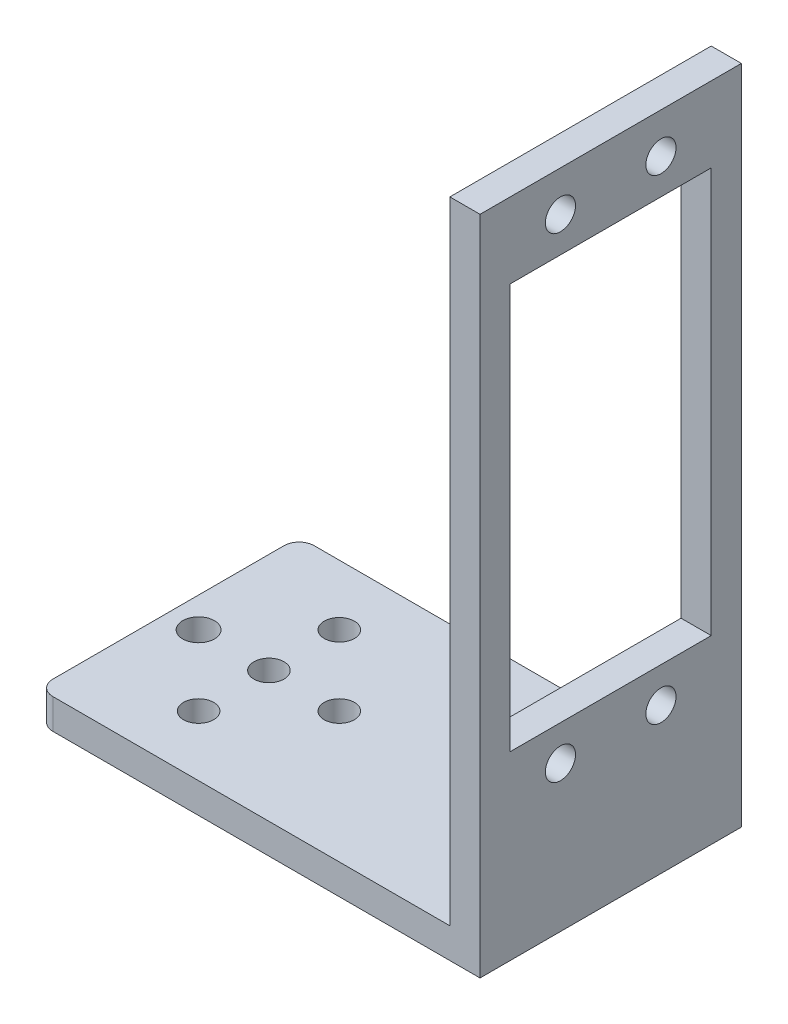
ISO-10303-21;
HEADER;
FILE_DESCRIPTION(('STEP AP214'),'2;1');
FILE_NAME('part.step','',(''),(''),'','','');
FILE_SCHEMA(('AUTOMOTIVE_DESIGN { 1 0 10303 214 1 1 1 1 }'));
ENDSEC;
DATA;
#1=APPLICATION_CONTEXT('core data for automotive mechanical design processes');
#2=APPLICATION_PROTOCOL_DEFINITION('international standard','automotive_design',2000,#1);
#3=PRODUCT_CONTEXT('',#1,'mechanical');
#4=PRODUCT('Part','Part','',(#3));
#5=PRODUCT_RELATED_PRODUCT_CATEGORY('part','',(#4));
#6=PRODUCT_DEFINITION_FORMATION('','',#4);
#7=PRODUCT_DEFINITION_CONTEXT('part definition',#1,'design');
#8=PRODUCT_DEFINITION('design','',#6,#7);
#9=PRODUCT_DEFINITION_SHAPE('','',#8);
#10=(LENGTH_UNIT() NAMED_UNIT(*) SI_UNIT(.MILLI.,.METRE.));
#11=(NAMED_UNIT(*) PLANE_ANGLE_UNIT() SI_UNIT($,.RADIAN.));
#12=(NAMED_UNIT(*) SI_UNIT($,.STERADIAN.) SOLID_ANGLE_UNIT());
#13=UNCERTAINTY_MEASURE_WITH_UNIT(LENGTH_MEASURE(1.E-05),#10,'distance_accuracy_value','');
#14=(GEOMETRIC_REPRESENTATION_CONTEXT(3) GLOBAL_UNCERTAINTY_ASSIGNED_CONTEXT((#13)) GLOBAL_UNIT_ASSIGNED_CONTEXT((#10,
#11,#12)) REPRESENTATION_CONTEXT('',''));
#15=CARTESIAN_POINT('',(0.,0.,0.));
#16=DIRECTION('',(0.,0.,1.));
#17=DIRECTION('',(1.,0.,0.));
#18=AXIS2_PLACEMENT_3D('',#15,#16,#17);
#19=CARTESIAN_POINT('',(0.,18.,0.));
#20=DIRECTION('',(0.,-1.,0.));
#21=DIRECTION('',(0.,0.,-1.));
#22=AXIS2_PLACEMENT_3D('',#19,#20,#21);
#23=PLANE('',#22);
#24=DIRECTION('',(-1.,0.,0.));
#25=VECTOR('',#24,1.);
#26=CARTESIAN_POINT('',(0.,18.,-3.00000000000004));
#27=LINE('',#26,#25);
#28=CARTESIAN_POINT('',(44.,18.,-3.00000000000001));
#29=VERTEX_POINT('',#28);
#30=CARTESIAN_POINT('',(41.,18.,-3.));
#31=VERTEX_POINT('',#30);
#32=EDGE_CURVE('E63',#29,#31,#27,.T.);
#33=ORIENTED_EDGE('',*,*,#32,.F.);
#34=DIRECTION('',(0.,0.,-1.));
#35=VECTOR('',#34,1.);
#36=CARTESIAN_POINT('',(44.,18.,-26.));
#37=LINE('',#36,#35);
#38=CARTESIAN_POINT('',(44.,18.,-23.));
#39=VERTEX_POINT('',#38);
#40=EDGE_CURVE('E204',#29,#39,#37,.T.);
#41=ORIENTED_EDGE('',*,*,#40,.T.);
#42=DIRECTION('',(-1.,0.,0.));
#43=VECTOR('',#42,1.);
#44=CARTESIAN_POINT('',(0.,18.,-23.));
#45=LINE('',#44,#43);
#46=CARTESIAN_POINT('',(41.,18.,-23.));
#47=VERTEX_POINT('',#46);
#48=EDGE_CURVE('E181',#39,#47,#45,.T.);
#49=ORIENTED_EDGE('',*,*,#48,.T.);
#50=DIRECTION('',(0.,0.,1.));
#51=VECTOR('',#50,1.);
#52=CARTESIAN_POINT('',(41.,18.,0.));
#53=LINE('',#52,#51);
#54=EDGE_CURVE('E59',#47,#31,#53,.T.);
#55=ORIENTED_EDGE('',*,*,#54,.T.);
#56=EDGE_LOOP('',(#33,#41,#49,#55));
#57=FACE_BOUND('',#56,.T.);
#58=ADVANCED_FACE('F44',(#57),#23,.F.);
#59=CARTESIAN_POINT('',(1.5,3.,-1.5));
#60=DIRECTION('',(0.,1.,0.));
#61=DIRECTION('',(0.,0.,1.));
#62=AXIS2_PLACEMENT_3D('',#59,#60,#61);
#63=PLANE('',#62);
#64=DIRECTION('',(0.,0.,1.));
#65=VECTOR('',#64,1.);
#66=CARTESIAN_POINT('',(41.,3.,0.));
#67=LINE('',#66,#65);
#68=CARTESIAN_POINT('',(41.,3.,-26.));
#69=VERTEX_POINT('',#68);
#70=CARTESIAN_POINT('',(41.,3.,0.));
#71=VERTEX_POINT('',#70);
#72=EDGE_CURVE('E203',#69,#71,#67,.T.);
#73=ORIENTED_EDGE('',*,*,#72,.F.);
#74=DIRECTION('',(-1.,0.,0.));
#75=VECTOR('',#74,1.);
#76=CARTESIAN_POINT('',(1.50000000000001,3.,-26.));
#77=LINE('',#76,#75);
#78=CARTESIAN_POINT('',(1.50000000000001,3.,-26.));
#79=VERTEX_POINT('',#78);
#80=EDGE_CURVE('E139',#69,#79,#77,.T.);
#81=ORIENTED_EDGE('',*,*,#80,.T.);
#82=CARTESIAN_POINT('',(1.5,3.,-24.5));
#83=DIRECTION('',(0.,1.,0.));
#84=DIRECTION('',(0.,0.,-1.));
#85=AXIS2_PLACEMENT_3D('',#82,#83,#84);
#86=CIRCLE('',#85,1.5);
#87=CARTESIAN_POINT('',(0.,3.,-24.5));
#88=VERTEX_POINT('',#87);
#89=EDGE_CURVE('E240',#79,#88,#86,.T.);
#90=ORIENTED_EDGE('',*,*,#89,.T.);
#91=DIRECTION('',(0.,0.,1.));
#92=VECTOR('',#91,1.);
#93=CARTESIAN_POINT('',(0.,3.,-1.50000000000001));
#94=LINE('',#93,#92);
#95=CARTESIAN_POINT('',(0.,3.,-1.50000000000001));
#96=VERTEX_POINT('',#95);
#97=EDGE_CURVE('E243',#88,#96,#94,.T.);
#98=ORIENTED_EDGE('',*,*,#97,.T.);
#99=CARTESIAN_POINT('',(1.5,3.,-1.5));
#100=DIRECTION('',(0.,1.,0.));
#101=DIRECTION('',(0.,0.,1.));
#102=AXIS2_PLACEMENT_3D('',#99,#100,#101);
#103=CIRCLE('',#102,1.5);
#104=CARTESIAN_POINT('',(1.5,3.,0.));
#105=VERTEX_POINT('',#104);
#106=EDGE_CURVE('E245',#96,#105,#103,.T.);
#107=ORIENTED_EDGE('',*,*,#106,.T.);
#108=DIRECTION('',(1.,0.,0.));
#109=VECTOR('',#108,1.);
#110=CARTESIAN_POINT('',(44.,3.,0.));
#111=LINE('',#110,#109);
#112=EDGE_CURVE('E247',#105,#71,#111,.T.);
#113=ORIENTED_EDGE('',*,*,#112,.T.);
#114=EDGE_LOOP('',(#73,#81,#90,#98,#107,#113));
#115=FACE_BOUND('',#114,.T.);
#116=CARTESIAN_POINT('',(9.99999999999999,3.,-6.));
#117=DIRECTION('',(0.,1.,0.));
#118=DIRECTION('',(0.,0.,1.));
#119=AXIS2_PLACEMENT_3D('',#116,#117,#118);
#120=CIRCLE('',#119,1.5);
#121=CARTESIAN_POINT('',(9.99999999999999,3.,-4.5));
#122=VERTEX_POINT('',#121);
#123=EDGE_CURVE('E215',#122,#122,#120,.T.);
#124=ORIENTED_EDGE('',*,*,#123,.F.);
#125=EDGE_LOOP('',(#124));
#126=FACE_BOUND('',#125,.T.);
#127=CARTESIAN_POINT('',(17.,3.,-13.));
#128=DIRECTION('',(0.,1.,0.));
#129=DIRECTION('',(0.,0.,1.));
#130=AXIS2_PLACEMENT_3D('',#127,#128,#129);
#131=CIRCLE('',#130,1.5);
#132=CARTESIAN_POINT('',(17.,3.,-11.5));
#133=VERTEX_POINT('',#132);
#134=EDGE_CURVE('E227',#133,#133,#131,.T.);
#135=ORIENTED_EDGE('',*,*,#134,.F.);
#136=EDGE_LOOP('',(#135));
#137=FACE_BOUND('',#136,.T.);
#138=CARTESIAN_POINT('',(9.99999999999999,3.,-13.));
#139=DIRECTION('',(0.,1.,0.));
#140=DIRECTION('',(0.,0.,1.));
#141=AXIS2_PLACEMENT_3D('',#138,#139,#140);
#142=CIRCLE('',#141,1.5);
#143=CARTESIAN_POINT('',(9.99999999999999,3.,-11.5));
#144=VERTEX_POINT('',#143);
#145=EDGE_CURVE('E233',#144,#144,#142,.T.);
#146=ORIENTED_EDGE('',*,*,#145,.F.);
#147=EDGE_LOOP('',(#146));
#148=FACE_BOUND('',#147,.T.);
#149=CARTESIAN_POINT('',(9.99999999999999,3.,-20.));
#150=DIRECTION('',(0.,1.,0.));
#151=DIRECTION('',(0.,0.,1.));
#152=AXIS2_PLACEMENT_3D('',#149,#150,#151);
#153=CIRCLE('',#152,1.5);
#154=CARTESIAN_POINT('',(9.99999999999999,3.,-18.5));
#155=VERTEX_POINT('',#154);
#156=EDGE_CURVE('E221',#155,#155,#153,.T.);
#157=ORIENTED_EDGE('',*,*,#156,.F.);
#158=EDGE_LOOP('',(#157));
#159=FACE_BOUND('',#158,.T.);
#160=CARTESIAN_POINT('',(2.99999999999999,3.,-13.));
#161=DIRECTION('',(0.,1.,0.));
#162=DIRECTION('',(0.,0.,1.));
#163=AXIS2_PLACEMENT_3D('',#160,#161,#162);
#164=CIRCLE('',#163,1.58);
#165=CARTESIAN_POINT('',(2.99999999999999,3.,-11.42));
#166=VERTEX_POINT('',#165);
#167=EDGE_CURVE('E209',#166,#166,#164,.T.);
#168=ORIENTED_EDGE('',*,*,#167,.F.);
#169=EDGE_LOOP('',(#168));
#170=FACE_BOUND('',#169,.T.);
#171=ADVANCED_FACE('F294',(#115,#126,#137,#148,#159,#170),#63,.T.);
#172=CARTESIAN_POINT('',(1.5,0.,-1.5));
#173=DIRECTION('',(0.,1.,0.));
#174=DIRECTION('',(0.,0.,1.));
#175=AXIS2_PLACEMENT_3D('',#172,#173,#174);
#176=PLANE('',#175);
#177=DIRECTION('',(0.,0.,-1.));
#178=VECTOR('',#177,1.);
#179=CARTESIAN_POINT('',(44.,0.,-26.));
#180=LINE('',#179,#178);
#181=CARTESIAN_POINT('',(44.,0.,0.));
#182=VERTEX_POINT('',#181);
#183=CARTESIAN_POINT('',(44.,0.,-26.));
#184=VERTEX_POINT('',#183);
#185=EDGE_CURVE('E236',#182,#184,#180,.T.);
#186=ORIENTED_EDGE('',*,*,#185,.F.);
#187=DIRECTION('',(1.,0.,0.));
#188=VECTOR('',#187,1.);
#189=CARTESIAN_POINT('',(44.,0.,0.));
#190=LINE('',#189,#188);
#191=CARTESIAN_POINT('',(1.5,0.,0.));
#192=VERTEX_POINT('',#191);
#193=EDGE_CURVE('E241',#192,#182,#190,.T.);
#194=ORIENTED_EDGE('',*,*,#193,.F.);
#195=CARTESIAN_POINT('',(1.5,0.,-1.5));
#196=DIRECTION('',(0.,1.,0.));
#197=DIRECTION('',(0.,0.,1.));
#198=AXIS2_PLACEMENT_3D('',#195,#196,#197);
#199=CIRCLE('',#198,1.5);
#200=CARTESIAN_POINT('',(0.,0.,-1.50000000000001));
#201=VERTEX_POINT('',#200);
#202=EDGE_CURVE('E258',#201,#192,#199,.T.);
#203=ORIENTED_EDGE('',*,*,#202,.F.);
#204=DIRECTION('',(0.,0.,1.));
#205=VECTOR('',#204,1.);
#206=CARTESIAN_POINT('',(0.,0.,-1.50000000000001));
#207=LINE('',#206,#205);
#208=CARTESIAN_POINT('',(0.,0.,-24.5));
#209=VERTEX_POINT('',#208);
#210=EDGE_CURVE('E256',#209,#201,#207,.T.);
#211=ORIENTED_EDGE('',*,*,#210,.F.);
#212=CARTESIAN_POINT('',(1.5,0.,-24.5));
#213=DIRECTION('',(0.,1.,0.));
#214=DIRECTION('',(0.,0.,-1.));
#215=AXIS2_PLACEMENT_3D('',#212,#213,#214);
#216=CIRCLE('',#215,1.5);
#217=CARTESIAN_POINT('',(1.50000000000001,0.,-26.));
#218=VERTEX_POINT('',#217);
#219=EDGE_CURVE('E254',#218,#209,#216,.T.);
#220=ORIENTED_EDGE('',*,*,#219,.F.);
#221=DIRECTION('',(-1.,0.,0.));
#222=VECTOR('',#221,1.);
#223=CARTESIAN_POINT('',(1.50000000000001,0.,-26.));
#224=LINE('',#223,#222);
#225=EDGE_CURVE('E252',#184,#218,#224,.T.);
#226=ORIENTED_EDGE('',*,*,#225,.F.);
#227=EDGE_LOOP('',(#186,#194,#203,#211,#220,#226));
#228=FACE_BOUND('',#227,.T.);
#229=CARTESIAN_POINT('',(9.99999999999999,0.,-13.));
#230=DIRECTION('',(0.,1.,0.));
#231=DIRECTION('',(0.,0.,1.));
#232=AXIS2_PLACEMENT_3D('',#229,#230,#231);
#233=CIRCLE('',#232,1.5);
#234=CARTESIAN_POINT('',(9.99999999999999,0.,-11.5));
#235=VERTEX_POINT('',#234);
#236=EDGE_CURVE('E230',#235,#235,#233,.T.);
#237=ORIENTED_EDGE('',*,*,#236,.T.);
#238=EDGE_LOOP('',(#237));
#239=FACE_BOUND('',#238,.T.);
#240=CARTESIAN_POINT('',(17.,0.,-13.));
#241=DIRECTION('',(0.,1.,0.));
#242=DIRECTION('',(0.,0.,1.));
#243=AXIS2_PLACEMENT_3D('',#240,#241,#242);
#244=CIRCLE('',#243,1.5);
#245=CARTESIAN_POINT('',(17.,0.,-11.5));
#246=VERTEX_POINT('',#245);
#247=EDGE_CURVE('E224',#246,#246,#244,.T.);
#248=ORIENTED_EDGE('',*,*,#247,.T.);
#249=EDGE_LOOP('',(#248));
#250=FACE_BOUND('',#249,.T.);
#251=CARTESIAN_POINT('',(9.99999999999999,0.,-20.));
#252=DIRECTION('',(0.,1.,0.));
#253=DIRECTION('',(0.,0.,1.));
#254=AXIS2_PLACEMENT_3D('',#251,#252,#253);
#255=CIRCLE('',#254,1.5);
#256=CARTESIAN_POINT('',(9.99999999999999,0.,-18.5));
#257=VERTEX_POINT('',#256);
#258=EDGE_CURVE('E218',#257,#257,#255,.T.);
#259=ORIENTED_EDGE('',*,*,#258,.T.);
#260=EDGE_LOOP('',(#259));
#261=FACE_BOUND('',#260,.T.);
#262=CARTESIAN_POINT('',(9.99999999999999,0.,-6.));
#263=DIRECTION('',(0.,1.,0.));
#264=DIRECTION('',(0.,0.,1.));
#265=AXIS2_PLACEMENT_3D('',#262,#263,#264);
#266=CIRCLE('',#265,1.5);
#267=CARTESIAN_POINT('',(9.99999999999999,0.,-4.5));
#268=VERTEX_POINT('',#267);
#269=EDGE_CURVE('E212',#268,#268,#266,.T.);
#270=ORIENTED_EDGE('',*,*,#269,.T.);
#271=EDGE_LOOP('',(#270));
#272=FACE_BOUND('',#271,.T.);
#273=CARTESIAN_POINT('',(2.99999999999999,0.,-13.));
#274=DIRECTION('',(0.,1.,0.));
#275=DIRECTION('',(0.,0.,1.));
#276=AXIS2_PLACEMENT_3D('',#273,#274,#275);
#277=CIRCLE('',#276,1.58);
#278=CARTESIAN_POINT('',(2.99999999999999,0.,-11.42));
#279=VERTEX_POINT('',#278);
#280=EDGE_CURVE('E142',#279,#279,#277,.T.);
#281=ORIENTED_EDGE('',*,*,#280,.T.);
#282=EDGE_LOOP('',(#281));
#283=FACE_BOUND('',#282,.T.);
#284=ADVANCED_FACE('F280',(#228,#239,#250,#261,#272,#283),#176,.F.);
#285=CARTESIAN_POINT('',(44.,3.,-26.));
#286=DIRECTION('',(-1.,0.,0.));
#287=DIRECTION('',(0.,0.,1.));
#288=AXIS2_PLACEMENT_3D('',#285,#286,#287);
#289=PLANE('',#288);
#290=CARTESIAN_POINT('',(44.,61.8,-18.));
#291=DIRECTION('',(-1.,0.,0.));
#292=DIRECTION('',(0.,0.,1.));
#293=AXIS2_PLACEMENT_3D('',#290,#291,#292);
#294=CIRCLE('',#293,1.5);
#295=CARTESIAN_POINT('',(44.,61.8,-16.5));
#296=VERTEX_POINT('',#295);
#297=EDGE_CURVE('E164',#296,#296,#294,.T.);
#298=ORIENTED_EDGE('',*,*,#297,.T.);
#299=EDGE_LOOP('',(#298));
#300=FACE_BOUND('',#299,.T.);
#301=CARTESIAN_POINT('',(44.,61.8,-8.));
#302=DIRECTION('',(-1.,0.,0.));
#303=DIRECTION('',(0.,0.,1.));
#304=AXIS2_PLACEMENT_3D('',#301,#302,#303);
#305=CIRCLE('',#304,1.5);
#306=CARTESIAN_POINT('',(44.,61.8,-6.5));
#307=VERTEX_POINT('',#306);
#308=EDGE_CURVE('E449',#307,#307,#305,.T.);
#309=ORIENTED_EDGE('',*,*,#308,.T.);
#310=EDGE_LOOP('',(#309));
#311=FACE_BOUND('',#310,.T.);
#312=DIRECTION('',(0.,-1.,0.));
#313=VECTOR('',#312,1.);
#314=CARTESIAN_POINT('',(44.,3.,-26.));
#315=LINE('',#314,#313);
#316=CARTESIAN_POINT('',(44.,65.8,-26.));
#317=VERTEX_POINT('',#316);
#318=EDGE_CURVE('E11',#317,#184,#315,.T.);
#319=ORIENTED_EDGE('',*,*,#318,.F.);
#320=DIRECTION('',(0.,0.,-1.));
#321=VECTOR('',#320,1.);
#322=CARTESIAN_POINT('',(44.,65.8,0.));
#323=LINE('',#322,#321);
#324=CARTESIAN_POINT('',(44.,65.8,0.));
#325=VERTEX_POINT('',#324);
#326=EDGE_CURVE('E157',#325,#317,#323,.T.);
#327=ORIENTED_EDGE('',*,*,#326,.F.);
#328=DIRECTION('',(0.,-1.,0.));
#329=VECTOR('',#328,1.);
#330=CARTESIAN_POINT('',(44.,3.,0.));
#331=LINE('',#330,#329);
#332=EDGE_CURVE('E249',#325,#182,#331,.T.);
#333=ORIENTED_EDGE('',*,*,#332,.T.);
#334=ORIENTED_EDGE('',*,*,#185,.T.);
#335=EDGE_LOOP('',(#319,#327,#333,#334));
#336=FACE_BOUND('',#335,.T.);
#337=CARTESIAN_POINT('',(44.,14.5,-18.));
#338=DIRECTION('',(-1.,0.,0.));
#339=DIRECTION('',(0.,0.,1.));
#340=AXIS2_PLACEMENT_3D('',#337,#338,#339);
#341=CIRCLE('',#340,1.5);
#342=CARTESIAN_POINT('',(44.,14.5,-16.5));
#343=VERTEX_POINT('',#342);
#344=EDGE_CURVE('E200',#343,#343,#341,.T.);
#345=ORIENTED_EDGE('',*,*,#344,.T.);
#346=EDGE_LOOP('',(#345));
#347=FACE_BOUND('',#346,.T.);
#348=CARTESIAN_POINT('',(44.,14.5,-8.));
#349=DIRECTION('',(-1.,0.,0.));
#350=DIRECTION('',(0.,0.,1.));
#351=AXIS2_PLACEMENT_3D('',#348,#349,#350);
#352=CIRCLE('',#351,1.5);
#353=CARTESIAN_POINT('',(44.,14.5,-6.5));
#354=VERTEX_POINT('',#353);
#355=EDGE_CURVE('E195',#354,#354,#352,.T.);
#356=ORIENTED_EDGE('',*,*,#355,.T.);
#357=EDGE_LOOP('',(#356));
#358=FACE_BOUND('',#357,.T.);
#359=DIRECTION('',(0.,0.,-1.));
#360=VECTOR('',#359,1.);
#361=CARTESIAN_POINT('',(44.,58.3,0.));
#362=LINE('',#361,#360);
#363=CARTESIAN_POINT('',(44.,58.3,-3.));
#364=VERTEX_POINT('',#363);
#365=CARTESIAN_POINT('',(44.,58.3,-23.));
#366=VERTEX_POINT('',#365);
#367=EDGE_CURVE('E158',#364,#366,#362,.T.);
#368=ORIENTED_EDGE('',*,*,#367,.T.);
#369=DIRECTION('',(0.,-1.,0.));
#370=VECTOR('',#369,1.);
#371=CARTESIAN_POINT('',(44.,58.3,-23.));
#372=LINE('',#371,#370);
#373=EDGE_CURVE('E188',#366,#39,#372,.T.);
#374=ORIENTED_EDGE('',*,*,#373,.T.);
#375=ORIENTED_EDGE('',*,*,#40,.F.);
#376=DIRECTION('',(0.,-1.,0.));
#377=VECTOR('',#376,1.);
#378=CARTESIAN_POINT('',(44.,58.3,-3.));
#379=LINE('',#378,#377);
#380=EDGE_CURVE('E178',#364,#29,#379,.T.);
#381=ORIENTED_EDGE('',*,*,#380,.F.);
#382=EDGE_LOOP('',(#368,#374,#375,#381));
#383=FACE_BOUND('',#382,.T.);
#384=ADVANCED_FACE('F46',(#300,#311,#336,#347,#358,#383),#289,.F.);
#385=CARTESIAN_POINT('',(1.50000000000001,3.,-26.));
#386=DIRECTION('',(0.,0.,1.));
#387=DIRECTION('',(1.,0.,0.));
#388=AXIS2_PLACEMENT_3D('',#385,#386,#387);
#389=PLANE('',#388);
#390=ORIENTED_EDGE('',*,*,#225,.T.);
#391=DIRECTION('',(0.,-1.,0.));
#392=VECTOR('',#391,1.);
#393=CARTESIAN_POINT('',(1.50000000000001,3.,-26.));
#394=LINE('',#393,#392);
#395=EDGE_CURVE('E52',#79,#218,#394,.T.);
#396=ORIENTED_EDGE('',*,*,#395,.F.);
#397=ORIENTED_EDGE('',*,*,#80,.F.);
#398=DIRECTION('',(0.,-1.,0.));
#399=VECTOR('',#398,1.);
#400=CARTESIAN_POINT('',(41.,18.,-26.));
#401=LINE('',#400,#399);
#402=CARTESIAN_POINT('',(41.,65.8,-26.));
#403=VERTEX_POINT('',#402);
#404=EDGE_CURVE('E133',#403,#69,#401,.T.);
#405=ORIENTED_EDGE('',*,*,#404,.F.);
#406=DIRECTION('',(-1.,0.,0.));
#407=VECTOR('',#406,1.);
#408=CARTESIAN_POINT('',(44.,65.8,-26.));
#409=LINE('',#408,#407);
#410=EDGE_CURVE('E137',#317,#403,#409,.T.);
#411=ORIENTED_EDGE('',*,*,#410,.F.);
#412=ORIENTED_EDGE('',*,*,#318,.T.);
#413=EDGE_LOOP('',(#390,#396,#397,#405,#411,#412));
#414=FACE_BOUND('',#413,.T.);
#415=ADVANCED_FACE('F135',(#414),#389,.F.);
#416=CARTESIAN_POINT('',(1.5,3.,-24.5));
#417=DIRECTION('',(0.,-1.,0.));
#418=DIRECTION('',(0.,0.,-1.));
#419=AXIS2_PLACEMENT_3D('',#416,#417,#418);
#420=CYLINDRICAL_SURFACE('',#419,1.5);
#421=ORIENTED_EDGE('',*,*,#219,.T.);
#422=DIRECTION('',(0.,-1.,0.));
#423=VECTOR('',#422,1.);
#424=CARTESIAN_POINT('',(0.,3.,-24.5));
#425=LINE('',#424,#423);
#426=EDGE_CURVE('E269',#88,#209,#425,.T.);
#427=ORIENTED_EDGE('',*,*,#426,.F.);
#428=ORIENTED_EDGE('',*,*,#89,.F.);
#429=ORIENTED_EDGE('',*,*,#395,.T.);
#430=EDGE_LOOP('',(#421,#427,#428,#429));
#431=FACE_BOUND('',#430,.T.);
#432=ADVANCED_FACE('F275',(#431),#420,.T.);
#433=CARTESIAN_POINT('',(0.,3.,-1.50000000000001));
#434=DIRECTION('',(1.,0.,0.));
#435=DIRECTION('',(0.,0.,-1.));
#436=AXIS2_PLACEMENT_3D('',#433,#434,#435);
#437=PLANE('',#436);
#438=ORIENTED_EDGE('',*,*,#210,.T.);
#439=DIRECTION('',(0.,-1.,0.));
#440=VECTOR('',#439,1.);
#441=CARTESIAN_POINT('',(0.,3.,-1.50000000000001));
#442=LINE('',#441,#440);
#443=EDGE_CURVE('E266',#96,#201,#442,.T.);
#444=ORIENTED_EDGE('',*,*,#443,.F.);
#445=ORIENTED_EDGE('',*,*,#97,.F.);
#446=ORIENTED_EDGE('',*,*,#426,.T.);
#447=EDGE_LOOP('',(#438,#444,#445,#446));
#448=FACE_BOUND('',#447,.T.);
#449=ADVANCED_FACE('F286',(#448),#437,.F.);
#450=CARTESIAN_POINT('',(1.5,3.,-1.5));
#451=DIRECTION('',(0.,-1.,0.));
#452=DIRECTION('',(0.,0.,-1.));
#453=AXIS2_PLACEMENT_3D('',#450,#451,#452);
#454=CYLINDRICAL_SURFACE('',#453,1.5);
#455=ORIENTED_EDGE('',*,*,#202,.T.);
#456=DIRECTION('',(0.,-1.,0.));
#457=VECTOR('',#456,1.);
#458=CARTESIAN_POINT('',(1.5,3.,0.));
#459=LINE('',#458,#457);
#460=EDGE_CURVE('E263',#105,#192,#459,.T.);
#461=ORIENTED_EDGE('',*,*,#460,.F.);
#462=ORIENTED_EDGE('',*,*,#106,.F.);
#463=ORIENTED_EDGE('',*,*,#443,.T.);
#464=EDGE_LOOP('',(#455,#461,#462,#463));
#465=FACE_BOUND('',#464,.T.);
#466=ADVANCED_FACE('F290',(#465),#454,.T.);
#467=CARTESIAN_POINT('',(44.,3.,0.));
#468=DIRECTION('',(0.,0.,-1.));
#469=DIRECTION('',(-1.,0.,0.));
#470=AXIS2_PLACEMENT_3D('',#467,#468,#469);
#471=PLANE('',#470);
#472=ORIENTED_EDGE('',*,*,#193,.T.);
#473=ORIENTED_EDGE('',*,*,#332,.F.);
#474=DIRECTION('',(1.,0.,0.));
#475=VECTOR('',#474,1.);
#476=CARTESIAN_POINT('',(41.,65.8,0.));
#477=LINE('',#476,#475);
#478=CARTESIAN_POINT('',(41.,65.8,0.));
#479=VERTEX_POINT('',#478);
#480=EDGE_CURVE('E152',#479,#325,#477,.T.);
#481=ORIENTED_EDGE('',*,*,#480,.F.);
#482=DIRECTION('',(0.,-1.,0.));
#483=VECTOR('',#482,1.);
#484=CARTESIAN_POINT('',(41.,18.,0.));
#485=LINE('',#484,#483);
#486=EDGE_CURVE('E143',#479,#71,#485,.T.);
#487=ORIENTED_EDGE('',*,*,#486,.T.);
#488=ORIENTED_EDGE('',*,*,#112,.F.);
#489=ORIENTED_EDGE('',*,*,#460,.T.);
#490=EDGE_LOOP('',(#472,#473,#481,#487,#488,#489));
#491=FACE_BOUND('',#490,.T.);
#492=ADVANCED_FACE('F297',(#491),#471,.F.);
#493=CARTESIAN_POINT('',(9.99999999999999,3.,-13.));
#494=DIRECTION('',(0.,-1.,0.));
#495=DIRECTION('',(0.,0.,-1.));
#496=AXIS2_PLACEMENT_3D('',#493,#494,#495);
#497=CYLINDRICAL_SURFACE('',#496,1.5);
#498=ORIENTED_EDGE('',*,*,#145,.T.);
#499=EDGE_LOOP('',(#498));
#500=FACE_BOUND('',#499,.T.);
#501=ORIENTED_EDGE('',*,*,#236,.F.);
#502=EDGE_LOOP('',(#501));
#503=FACE_BOUND('',#502,.T.);
#504=ADVANCED_FACE('F358',(#500,#503),#497,.F.);
#505=CARTESIAN_POINT('',(17.,3.,-13.));
#506=DIRECTION('',(0.,-1.,0.));
#507=DIRECTION('',(0.,0.,-1.));
#508=AXIS2_PLACEMENT_3D('',#505,#506,#507);
#509=CYLINDRICAL_SURFACE('',#508,1.5);
#510=ORIENTED_EDGE('',*,*,#134,.T.);
#511=EDGE_LOOP('',(#510));
#512=FACE_BOUND('',#511,.T.);
#513=ORIENTED_EDGE('',*,*,#247,.F.);
#514=EDGE_LOOP('',(#513));
#515=FACE_BOUND('',#514,.T.);
#516=ADVANCED_FACE('F354',(#512,#515),#509,.F.);
#517=CARTESIAN_POINT('',(9.99999999999999,3.,-20.));
#518=DIRECTION('',(0.,-1.,0.));
#519=DIRECTION('',(0.,0.,-1.));
#520=AXIS2_PLACEMENT_3D('',#517,#518,#519);
#521=CYLINDRICAL_SURFACE('',#520,1.5);
#522=ORIENTED_EDGE('',*,*,#156,.T.);
#523=EDGE_LOOP('',(#522));
#524=FACE_BOUND('',#523,.T.);
#525=ORIENTED_EDGE('',*,*,#258,.F.);
#526=EDGE_LOOP('',(#525));
#527=FACE_BOUND('',#526,.T.);
#528=ADVANCED_FACE('F350',(#524,#527),#521,.F.);
#529=CARTESIAN_POINT('',(9.99999999999999,3.,-6.));
#530=DIRECTION('',(0.,-1.,0.));
#531=DIRECTION('',(0.,0.,-1.));
#532=AXIS2_PLACEMENT_3D('',#529,#530,#531);
#533=CYLINDRICAL_SURFACE('',#532,1.5);
#534=ORIENTED_EDGE('',*,*,#123,.T.);
#535=EDGE_LOOP('',(#534));
#536=FACE_BOUND('',#535,.T.);
#537=ORIENTED_EDGE('',*,*,#269,.F.);
#538=EDGE_LOOP('',(#537));
#539=FACE_BOUND('',#538,.T.);
#540=ADVANCED_FACE('F346',(#536,#539),#533,.F.);
#541=CARTESIAN_POINT('',(2.99999999999999,3.,-13.));
#542=DIRECTION('',(0.,-1.,0.));
#543=DIRECTION('',(0.,0.,-1.));
#544=AXIS2_PLACEMENT_3D('',#541,#542,#543);
#545=CYLINDRICAL_SURFACE('',#544,1.58);
#546=ORIENTED_EDGE('',*,*,#167,.T.);
#547=EDGE_LOOP('',(#546));
#548=FACE_BOUND('',#547,.T.);
#549=ORIENTED_EDGE('',*,*,#280,.F.);
#550=EDGE_LOOP('',(#549));
#551=FACE_BOUND('',#550,.T.);
#552=ADVANCED_FACE('F342',(#548,#551),#545,.F.);
#553=CARTESIAN_POINT('',(41.,18.,0.));
#554=DIRECTION('',(1.,0.,0.));
#555=DIRECTION('',(0.,0.,-1.));
#556=AXIS2_PLACEMENT_3D('',#553,#554,#555);
#557=PLANE('',#556);
#558=CARTESIAN_POINT('',(41.,61.8,-18.));
#559=DIRECTION('',(-1.,0.,0.));
#560=DIRECTION('',(0.,0.,1.));
#561=AXIS2_PLACEMENT_3D('',#558,#559,#560);
#562=CIRCLE('',#561,1.5);
#563=CARTESIAN_POINT('',(41.,61.8,-16.5));
#564=VERTEX_POINT('',#563);
#565=EDGE_CURVE('E446',#564,#564,#562,.T.);
#566=ORIENTED_EDGE('',*,*,#565,.F.);
#567=EDGE_LOOP('',(#566));
#568=FACE_BOUND('',#567,.T.);
#569=CARTESIAN_POINT('',(41.,61.8,-8.));
#570=DIRECTION('',(-1.,0.,0.));
#571=DIRECTION('',(0.,0.,-1.));
#572=AXIS2_PLACEMENT_3D('',#569,#570,#571);
#573=CIRCLE('',#572,1.5);
#574=CARTESIAN_POINT('',(41.,61.8,-9.5));
#575=VERTEX_POINT('',#574);
#576=EDGE_CURVE('E453',#575,#575,#573,.T.);
#577=ORIENTED_EDGE('',*,*,#576,.F.);
#578=EDGE_LOOP('',(#577));
#579=FACE_BOUND('',#578,.T.);
#580=DIRECTION('',(0.,-1.,0.));
#581=VECTOR('',#580,1.);
#582=CARTESIAN_POINT('',(41.,58.3,-23.));
#583=LINE('',#582,#581);
#584=CARTESIAN_POINT('',(41.,58.3,-23.));
#585=VERTEX_POINT('',#584);
#586=EDGE_CURVE('E185',#585,#47,#583,.T.);
#587=ORIENTED_EDGE('',*,*,#586,.F.);
#588=DIRECTION('',(0.,0.,1.));
#589=VECTOR('',#588,1.);
#590=CARTESIAN_POINT('',(41.,58.3,-26.));
#591=LINE('',#590,#589);
#592=CARTESIAN_POINT('',(41.,58.3,-3.));
#593=VERTEX_POINT('',#592);
#594=EDGE_CURVE('E161',#585,#593,#591,.T.);
#595=ORIENTED_EDGE('',*,*,#594,.T.);
#596=DIRECTION('',(0.,-1.,0.));
#597=VECTOR('',#596,1.);
#598=CARTESIAN_POINT('',(41.,58.3,-3.));
#599=LINE('',#598,#597);
#600=EDGE_CURVE('E174',#593,#31,#599,.T.);
#601=ORIENTED_EDGE('',*,*,#600,.T.);
#602=ORIENTED_EDGE('',*,*,#54,.F.);
#603=EDGE_LOOP('',(#587,#595,#601,#602));
#604=FACE_BOUND('',#603,.T.);
#605=CARTESIAN_POINT('',(41.,14.5,-18.));
#606=DIRECTION('',(-1.,0.,0.));
#607=DIRECTION('',(0.,0.,1.));
#608=AXIS2_PLACEMENT_3D('',#605,#606,#607);
#609=CIRCLE('',#608,1.5);
#610=CARTESIAN_POINT('',(41.,14.5,-16.5));
#611=VERTEX_POINT('',#610);
#612=EDGE_CURVE('E192',#611,#611,#609,.T.);
#613=ORIENTED_EDGE('',*,*,#612,.F.);
#614=EDGE_LOOP('',(#613));
#615=FACE_BOUND('',#614,.T.);
#616=CARTESIAN_POINT('',(41.,14.5,-8.));
#617=DIRECTION('',(-1.,0.,0.));
#618=DIRECTION('',(0.,0.,-1.));
#619=AXIS2_PLACEMENT_3D('',#616,#617,#618);
#620=CIRCLE('',#619,1.5);
#621=CARTESIAN_POINT('',(41.,14.5,-9.5));
#622=VERTEX_POINT('',#621);
#623=EDGE_CURVE('E191',#622,#622,#620,.T.);
#624=ORIENTED_EDGE('',*,*,#623,.F.);
#625=EDGE_LOOP('',(#624));
#626=FACE_BOUND('',#625,.T.);
#627=ORIENTED_EDGE('',*,*,#72,.T.);
#628=ORIENTED_EDGE('',*,*,#486,.F.);
#629=DIRECTION('',(0.,0.,1.));
#630=VECTOR('',#629,1.);
#631=CARTESIAN_POINT('',(41.,65.8,-26.));
#632=LINE('',#631,#630);
#633=EDGE_CURVE('E146',#403,#479,#632,.T.);
#634=ORIENTED_EDGE('',*,*,#633,.F.);
#635=ORIENTED_EDGE('',*,*,#404,.T.);
#636=EDGE_LOOP('',(#627,#628,#634,#635));
#637=FACE_BOUND('',#636,.T.);
#638=ADVANCED_FACE('F147',(#568,#579,#604,#615,#626,#637),#557,.F.);
#639=CARTESIAN_POINT('',(56.,14.5,-8.));
#640=DIRECTION('',(-1.,0.,0.));
#641=DIRECTION('',(0.,0.,1.));
#642=AXIS2_PLACEMENT_3D('',#639,#640,#641);
#643=CYLINDRICAL_SURFACE('',#642,1.5);
#644=ORIENTED_EDGE('',*,*,#623,.T.);
#645=EDGE_LOOP('',(#644));
#646=FACE_BOUND('',#645,.T.);
#647=ORIENTED_EDGE('',*,*,#355,.F.);
#648=EDGE_LOOP('',(#647));
#649=FACE_BOUND('',#648,.T.);
#650=ADVANCED_FACE('F338',(#646,#649),#643,.F.);
#651=CARTESIAN_POINT('',(56.,14.5,-18.));
#652=DIRECTION('',(-1.,0.,0.));
#653=DIRECTION('',(0.,0.,1.));
#654=AXIS2_PLACEMENT_3D('',#651,#652,#653);
#655=CYLINDRICAL_SURFACE('',#654,1.5);
#656=ORIENTED_EDGE('',*,*,#612,.T.);
#657=EDGE_LOOP('',(#656));
#658=FACE_BOUND('',#657,.T.);
#659=ORIENTED_EDGE('',*,*,#344,.F.);
#660=EDGE_LOOP('',(#659));
#661=FACE_BOUND('',#660,.T.);
#662=ADVANCED_FACE('F326',(#658,#661),#655,.F.);
#663=CARTESIAN_POINT('',(0.,58.3,-23.));
#664=DIRECTION('',(0.,0.,1.));
#665=DIRECTION('',(1.,0.,0.));
#666=AXIS2_PLACEMENT_3D('',#663,#664,#665);
#667=PLANE('',#666);
#668=ORIENTED_EDGE('',*,*,#48,.F.);
#669=ORIENTED_EDGE('',*,*,#373,.F.);
#670=DIRECTION('',(-1.,0.,0.));
#671=VECTOR('',#670,1.);
#672=CARTESIAN_POINT('',(0.,58.3,-23.));
#673=LINE('',#672,#671);
#674=EDGE_CURVE('E182',#366,#585,#673,.T.);
#675=ORIENTED_EDGE('',*,*,#674,.T.);
#676=ORIENTED_EDGE('',*,*,#586,.T.);
#677=EDGE_LOOP('',(#668,#669,#675,#676));
#678=FACE_BOUND('',#677,.T.);
#679=ADVANCED_FACE('F314',(#678),#667,.T.);
#680=CARTESIAN_POINT('',(0.,58.3,-3.00000000000004));
#681=DIRECTION('',(0.,0.,1.));
#682=DIRECTION('',(1.,0.,0.));
#683=AXIS2_PLACEMENT_3D('',#680,#681,#682);
#684=PLANE('',#683);
#685=ORIENTED_EDGE('',*,*,#32,.T.);
#686=ORIENTED_EDGE('',*,*,#600,.F.);
#687=DIRECTION('',(-1.,0.,0.));
#688=VECTOR('',#687,1.);
#689=CARTESIAN_POINT('',(0.,58.3,-3.00000000000004));
#690=LINE('',#689,#688);
#691=EDGE_CURVE('E171',#364,#593,#690,.T.);
#692=ORIENTED_EDGE('',*,*,#691,.F.);
#693=ORIENTED_EDGE('',*,*,#380,.T.);
#694=EDGE_LOOP('',(#685,#686,#692,#693));
#695=FACE_BOUND('',#694,.T.);
#696=ADVANCED_FACE('F318',(#695),#684,.F.);
#697=CARTESIAN_POINT('',(0.,58.3,0.));
#698=DIRECTION('',(0.,1.,0.));
#699=DIRECTION('',(0.,0.,1.));
#700=AXIS2_PLACEMENT_3D('',#697,#698,#699);
#701=PLANE('',#700);
#702=ORIENTED_EDGE('',*,*,#674,.F.);
#703=ORIENTED_EDGE('',*,*,#367,.F.);
#704=ORIENTED_EDGE('',*,*,#691,.T.);
#705=ORIENTED_EDGE('',*,*,#594,.F.);
#706=EDGE_LOOP('',(#702,#703,#704,#705));
#707=FACE_BOUND('',#706,.T.);
#708=ADVANCED_FACE('F311',(#707),#701,.F.);
#709=CARTESIAN_POINT('',(0.,65.8,0.));
#710=DIRECTION('',(0.,1.,0.));
#711=DIRECTION('',(0.,0.,1.));
#712=AXIS2_PLACEMENT_3D('',#709,#710,#711);
#713=PLANE('',#712);
#714=ORIENTED_EDGE('',*,*,#410,.T.);
#715=ORIENTED_EDGE('',*,*,#633,.T.);
#716=ORIENTED_EDGE('',*,*,#480,.T.);
#717=ORIENTED_EDGE('',*,*,#326,.T.);
#718=EDGE_LOOP('',(#714,#715,#716,#717));
#719=FACE_BOUND('',#718,.T.);
#720=ADVANCED_FACE('F155',(#719),#713,.T.);
#721=CARTESIAN_POINT('',(48.5,61.8,-8.));
#722=DIRECTION('',(-1.,0.,0.));
#723=DIRECTION('',(0.,0.,1.));
#724=AXIS2_PLACEMENT_3D('',#721,#722,#723);
#725=CYLINDRICAL_SURFACE('',#724,1.5);
#726=ORIENTED_EDGE('',*,*,#576,.T.);
#727=EDGE_LOOP('',(#726));
#728=FACE_BOUND('',#727,.T.);
#729=ORIENTED_EDGE('',*,*,#308,.F.);
#730=EDGE_LOOP('',(#729));
#731=FACE_BOUND('',#730,.T.);
#732=ADVANCED_FACE('F415',(#728,#731),#725,.F.);
#733=CARTESIAN_POINT('',(48.5,61.8,-18.));
#734=DIRECTION('',(-1.,0.,0.));
#735=DIRECTION('',(0.,0.,1.));
#736=AXIS2_PLACEMENT_3D('',#733,#734,#735);
#737=CYLINDRICAL_SURFACE('',#736,1.5);
#738=ORIENTED_EDGE('',*,*,#565,.T.);
#739=EDGE_LOOP('',(#738));
#740=FACE_BOUND('',#739,.T.);
#741=ORIENTED_EDGE('',*,*,#297,.F.);
#742=EDGE_LOOP('',(#741));
#743=FACE_BOUND('',#742,.T.);
#744=ADVANCED_FACE('F419',(#740,#743),#737,.F.);
#745=CLOSED_SHELL('',(#58,#171,#284,#384,#415,#432,#449,#466,#492,#504,#516,#528,#540,#552,#638,
#650,#662,#679,#696,#708,#720,#732,#744));
#746=MANIFOLD_SOLID_BREP('B2',#745);
#747=ADVANCED_BREP_SHAPE_REPRESENTATION('',(#18,#746),#14);
#748=SHAPE_DEFINITION_REPRESENTATION(#9,#747);
ENDSEC;
END-ISO-10303-21;
